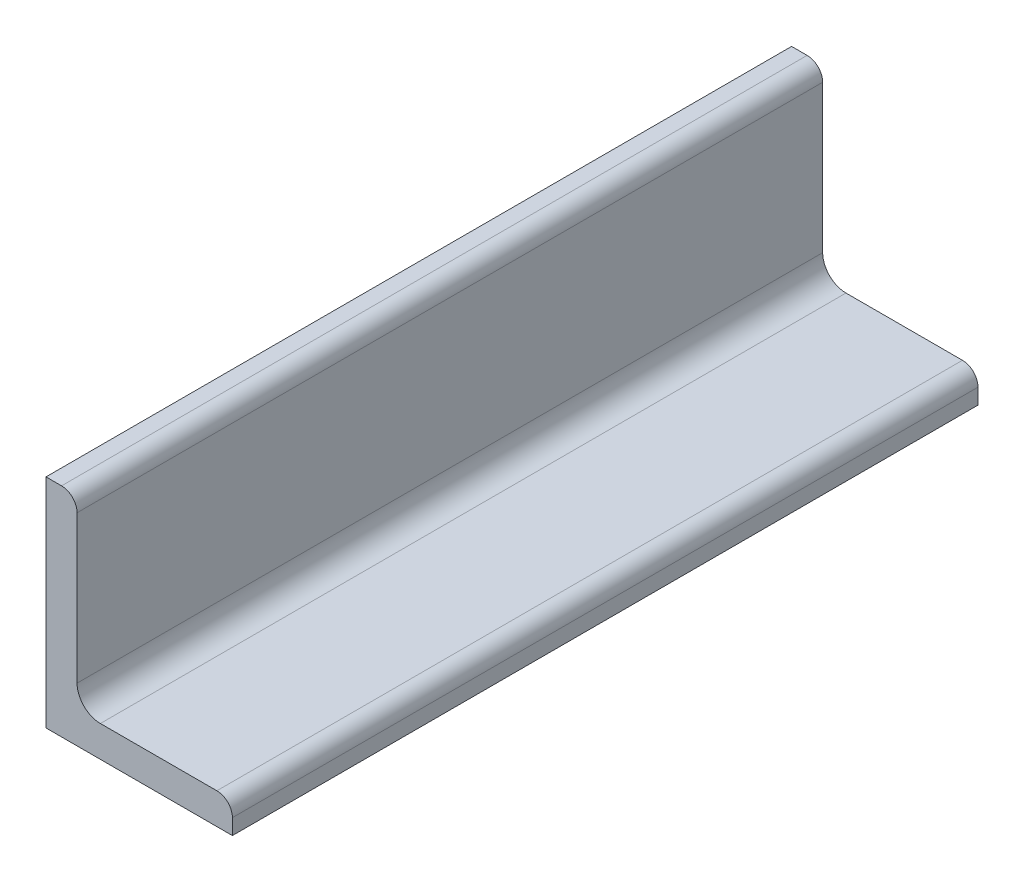
ISO-10303-21;
HEADER;
FILE_DESCRIPTION(('STEP AP214'),'2;1');
FILE_NAME('part.step','',(''),(''),'','','');
FILE_SCHEMA(('AUTOMOTIVE_DESIGN { 1 0 10303 214 1 1 1 1 }'));
ENDSEC;
DATA;
#1=APPLICATION_CONTEXT('core data for automotive mechanical design processes');
#2=APPLICATION_PROTOCOL_DEFINITION('international standard','automotive_design',2000,#1);
#3=PRODUCT_CONTEXT('',#1,'mechanical');
#4=PRODUCT('Part','Part','',(#3));
#5=PRODUCT_RELATED_PRODUCT_CATEGORY('part','',(#4));
#6=PRODUCT_DEFINITION_FORMATION('','',#4);
#7=PRODUCT_DEFINITION_CONTEXT('part definition',#1,'design');
#8=PRODUCT_DEFINITION('design','',#6,#7);
#9=PRODUCT_DEFINITION_SHAPE('','',#8);
#10=(LENGTH_UNIT() NAMED_UNIT(*) SI_UNIT(.MILLI.,.METRE.));
#11=(NAMED_UNIT(*) PLANE_ANGLE_UNIT() SI_UNIT($,.RADIAN.));
#12=(NAMED_UNIT(*) SI_UNIT($,.STERADIAN.) SOLID_ANGLE_UNIT());
#13=UNCERTAINTY_MEASURE_WITH_UNIT(LENGTH_MEASURE(1.E-05),#10,'distance_accuracy_value','');
#14=(GEOMETRIC_REPRESENTATION_CONTEXT(3) GLOBAL_UNCERTAINTY_ASSIGNED_CONTEXT((#13)) GLOBAL_UNIT_ASSIGNED_CONTEXT((#10,
#11,#12)) REPRESENTATION_CONTEXT('',''));
#15=CARTESIAN_POINT('',(0.,0.,0.));
#16=DIRECTION('',(0.,0.,1.));
#17=DIRECTION('',(1.,0.,0.));
#18=AXIS2_PLACEMENT_3D('',#15,#16,#17);
#19=CARTESIAN_POINT('',(0.490776827053332,89.7372005393545,304.8));
#20=DIRECTION('',(1.,0.,0.));
#21=DIRECTION('',(0.,0.,-1.));
#22=AXIS2_PLACEMENT_3D('',#19,#20,#21);
#23=PLANE('',#22);
#24=DIRECTION('',(0.,-1.,0.));
#25=VECTOR('',#24,1.);
#26=CARTESIAN_POINT('',(0.490776827053332,89.7372005393545,0.));
#27=LINE('',#26,#25);
#28=CARTESIAN_POINT('',(0.490776827053332,89.7372005393545,0.));
#29=VERTEX_POINT('',#28);
#30=CARTESIAN_POINT('',(0.490776827053332,0.837200539354535,0.));
#31=VERTEX_POINT('',#30);
#32=EDGE_CURVE('E135',#29,#31,#27,.T.);
#33=ORIENTED_EDGE('',*,*,#32,.T.);
#34=DIRECTION('',(0.,0.,-1.));
#35=VECTOR('',#34,1.);
#36=CARTESIAN_POINT('',(0.490776827053332,0.837200539354535,304.8));
#37=LINE('',#36,#35);
#38=CARTESIAN_POINT('',(0.490776827053332,0.837200539354535,304.8));
#39=VERTEX_POINT('',#38);
#40=EDGE_CURVE('E11',#39,#31,#37,.T.);
#41=ORIENTED_EDGE('',*,*,#40,.F.);
#42=DIRECTION('',(0.,-1.,0.));
#43=VECTOR('',#42,1.);
#44=CARTESIAN_POINT('',(0.490776827053332,89.7372005393545,304.8));
#45=LINE('',#44,#43);
#46=CARTESIAN_POINT('',(0.490776827053332,89.7372005393545,304.8));
#47=VERTEX_POINT('',#46);
#48=EDGE_CURVE('E151',#47,#39,#45,.T.);
#49=ORIENTED_EDGE('',*,*,#48,.F.);
#50=DIRECTION('',(0.,0.,-1.));
#51=VECTOR('',#50,1.);
#52=CARTESIAN_POINT('',(0.490776827053332,89.7372005393545,304.8));
#53=LINE('',#52,#51);
#54=EDGE_CURVE('E131',#47,#29,#53,.T.);
#55=ORIENTED_EDGE('',*,*,#54,.T.);
#56=EDGE_LOOP('',(#33,#41,#49,#55));
#57=FACE_BOUND('',#56,.T.);
#58=ADVANCED_FACE('F33',(#57),#23,.F.);
#59=CARTESIAN_POINT('',(0.490776827053332,0.837200539354535,304.8));
#60=DIRECTION('',(0.,1.,0.));
#61=DIRECTION('',(0.,0.,1.));
#62=AXIS2_PLACEMENT_3D('',#59,#60,#61);
#63=PLANE('',#62);
#64=DIRECTION('',(1.,0.,0.));
#65=VECTOR('',#64,1.);
#66=CARTESIAN_POINT('',(0.490776827053332,0.837200539354535,0.));
#67=LINE('',#66,#65);
#68=CARTESIAN_POINT('',(76.6907768270533,0.837200539354535,0.));
#69=VERTEX_POINT('',#68);
#70=EDGE_CURVE('E138',#31,#69,#67,.T.);
#71=ORIENTED_EDGE('',*,*,#70,.T.);
#72=DIRECTION('',(0.,0.,-1.));
#73=VECTOR('',#72,1.);
#74=CARTESIAN_POINT('',(76.6907768270533,0.837200539354535,304.8));
#75=LINE('',#74,#73);
#76=CARTESIAN_POINT('',(76.6907768270533,0.837200539354535,304.8));
#77=VERTEX_POINT('',#76);
#78=EDGE_CURVE('E41',#77,#69,#75,.T.);
#79=ORIENTED_EDGE('',*,*,#78,.F.);
#80=DIRECTION('',(1.,0.,0.));
#81=VECTOR('',#80,1.);
#82=CARTESIAN_POINT('',(0.490776827053332,0.837200539354535,304.8));
#83=LINE('',#82,#81);
#84=EDGE_CURVE('E95',#39,#77,#83,.T.);
#85=ORIENTED_EDGE('',*,*,#84,.F.);
#86=ORIENTED_EDGE('',*,*,#40,.T.);
#87=EDGE_LOOP('',(#71,#79,#85,#86));
#88=FACE_BOUND('',#87,.T.);
#89=ADVANCED_FACE('F194',(#88),#63,.F.);
#90=CARTESIAN_POINT('',(76.6907768270533,0.837200539354535,304.8));
#91=DIRECTION('',(-1.,0.,0.));
#92=DIRECTION('',(0.,0.,1.));
#93=AXIS2_PLACEMENT_3D('',#90,#91,#92);
#94=PLANE('',#93);
#95=DIRECTION('',(0.,1.,0.));
#96=VECTOR('',#95,1.);
#97=CARTESIAN_POINT('',(76.6907768270533,0.837200539354535,0.));
#98=LINE('',#97,#96);
#99=CARTESIAN_POINT('',(76.6907768270533,7.18720053935453,0.));
#100=VERTEX_POINT('',#99);
#101=EDGE_CURVE('E140',#69,#100,#98,.T.);
#102=ORIENTED_EDGE('',*,*,#101,.T.);
#103=DIRECTION('',(0.,0.,-1.));
#104=VECTOR('',#103,1.);
#105=CARTESIAN_POINT('',(76.6907768270533,7.18720053935453,304.8));
#106=LINE('',#105,#104);
#107=CARTESIAN_POINT('',(76.6907768270533,7.18720053935453,304.8));
#108=VERTEX_POINT('',#107);
#109=EDGE_CURVE('E161',#108,#100,#106,.T.);
#110=ORIENTED_EDGE('',*,*,#109,.F.);
#111=DIRECTION('',(0.,1.,0.));
#112=VECTOR('',#111,1.);
#113=CARTESIAN_POINT('',(76.6907768270533,0.837200539354535,304.8));
#114=LINE('',#113,#112);
#115=EDGE_CURVE('E169',#77,#108,#114,.T.);
#116=ORIENTED_EDGE('',*,*,#115,.F.);
#117=ORIENTED_EDGE('',*,*,#78,.T.);
#118=EDGE_LOOP('',(#102,#110,#116,#117));
#119=FACE_BOUND('',#118,.T.);
#120=ADVANCED_FACE('F167',(#119),#94,.F.);
#121=CARTESIAN_POINT('',(70.3407768270533,7.18720053935453,304.8));
#122=DIRECTION('',(0.,0.,-1.));
#123=DIRECTION('',(-1.,0.,0.));
#124=AXIS2_PLACEMENT_3D('',#121,#122,#123);
#125=CYLINDRICAL_SURFACE('',#124,6.35);
#126=CARTESIAN_POINT('',(70.3407768270533,7.18720053935453,0.));
#127=DIRECTION('',(0.,0.,1.));
#128=DIRECTION('',(1.,0.,0.));
#129=AXIS2_PLACEMENT_3D('',#126,#127,#128);
#130=CIRCLE('',#129,6.35);
#131=CARTESIAN_POINT('',(70.3407768270533,13.5372005393545,0.));
#132=VERTEX_POINT('',#131);
#133=EDGE_CURVE('E142',#100,#132,#130,.T.);
#134=ORIENTED_EDGE('',*,*,#133,.T.);
#135=DIRECTION('',(0.,0.,-1.));
#136=VECTOR('',#135,1.);
#137=CARTESIAN_POINT('',(70.3407768270533,13.5372005393545,304.8));
#138=LINE('',#137,#136);
#139=CARTESIAN_POINT('',(70.3407768270533,13.5372005393545,304.8));
#140=VERTEX_POINT('',#139);
#141=EDGE_CURVE('E158',#140,#132,#138,.T.);
#142=ORIENTED_EDGE('',*,*,#141,.F.);
#143=CARTESIAN_POINT('',(70.3407768270533,7.18720053935453,304.8));
#144=DIRECTION('',(0.,0.,1.));
#145=DIRECTION('',(1.,0.,0.));
#146=AXIS2_PLACEMENT_3D('',#143,#144,#145);
#147=CIRCLE('',#146,6.35);
#148=EDGE_CURVE('E185',#108,#140,#147,.T.);
#149=ORIENTED_EDGE('',*,*,#148,.F.);
#150=ORIENTED_EDGE('',*,*,#109,.T.);
#151=EDGE_LOOP('',(#134,#142,#149,#150));
#152=FACE_BOUND('',#151,.T.);
#153=ADVANCED_FACE('F178',(#152),#125,.T.);
#154=CARTESIAN_POINT('',(70.3407768270533,13.5372005393545,304.8));
#155=DIRECTION('',(0.,-1.,0.));
#156=DIRECTION('',(0.,0.,-1.));
#157=AXIS2_PLACEMENT_3D('',#154,#155,#156);
#158=PLANE('',#157);
#159=DIRECTION('',(-1.,0.,0.));
#160=VECTOR('',#159,1.);
#161=CARTESIAN_POINT('',(70.3407768270533,13.5372005393545,0.));
#162=LINE('',#161,#160);
#163=CARTESIAN_POINT('',(22.7157768270533,13.5372005393545,0.));
#164=VERTEX_POINT('',#163);
#165=EDGE_CURVE('E144',#132,#164,#162,.T.);
#166=ORIENTED_EDGE('',*,*,#165,.T.);
#167=DIRECTION('',(0.,0.,-1.));
#168=VECTOR('',#167,1.);
#169=CARTESIAN_POINT('',(22.7157768270533,13.5372005393545,304.8));
#170=LINE('',#169,#168);
#171=CARTESIAN_POINT('',(22.7157768270533,13.5372005393545,304.8));
#172=VERTEX_POINT('',#171);
#173=EDGE_CURVE('E155',#172,#164,#170,.T.);
#174=ORIENTED_EDGE('',*,*,#173,.F.);
#175=DIRECTION('',(-1.,0.,0.));
#176=VECTOR('',#175,1.);
#177=CARTESIAN_POINT('',(70.3407768270533,13.5372005393545,304.8));
#178=LINE('',#177,#176);
#179=EDGE_CURVE('E184',#140,#172,#178,.T.);
#180=ORIENTED_EDGE('',*,*,#179,.F.);
#181=ORIENTED_EDGE('',*,*,#141,.T.);
#182=EDGE_LOOP('',(#166,#174,#180,#181));
#183=FACE_BOUND('',#182,.T.);
#184=ADVANCED_FACE('F182',(#183),#158,.F.);
#185=CARTESIAN_POINT('',(22.7157768270533,23.0622005393545,304.8));
#186=DIRECTION('',(0.,0.,-1.));
#187=DIRECTION('',(-1.,0.,0.));
#188=AXIS2_PLACEMENT_3D('',#185,#186,#187);
#189=CYLINDRICAL_SURFACE('',#188,9.52499999999999);
#190=CARTESIAN_POINT('',(22.7157768270533,23.0622005393545,0.));
#191=DIRECTION('',(0.,0.,-1.));
#192=DIRECTION('',(1.,0.,0.));
#193=AXIS2_PLACEMENT_3D('',#190,#191,#192);
#194=CIRCLE('',#193,9.52499999999999);
#195=CARTESIAN_POINT('',(13.1907768270533,23.0622005393545,0.));
#196=VERTEX_POINT('',#195);
#197=EDGE_CURVE('E146',#164,#196,#194,.T.);
#198=ORIENTED_EDGE('',*,*,#197,.T.);
#199=DIRECTION('',(0.,0.,-1.));
#200=VECTOR('',#199,1.);
#201=CARTESIAN_POINT('',(13.1907768270533,23.0622005393545,304.8));
#202=LINE('',#201,#200);
#203=CARTESIAN_POINT('',(13.1907768270533,23.0622005393545,304.8));
#204=VERTEX_POINT('',#203);
#205=EDGE_CURVE('E126',#204,#196,#202,.T.);
#206=ORIENTED_EDGE('',*,*,#205,.F.);
#207=CARTESIAN_POINT('',(22.7157768270533,23.0622005393545,304.8));
#208=DIRECTION('',(0.,0.,-1.));
#209=DIRECTION('',(1.,0.,0.));
#210=AXIS2_PLACEMENT_3D('',#207,#208,#209);
#211=CIRCLE('',#210,9.52499999999999);
#212=EDGE_CURVE('E117',#172,#204,#211,.T.);
#213=ORIENTED_EDGE('',*,*,#212,.F.);
#214=ORIENTED_EDGE('',*,*,#173,.T.);
#215=EDGE_LOOP('',(#198,#206,#213,#214));
#216=FACE_BOUND('',#215,.T.);
#217=ADVANCED_FACE('F206',(#216),#189,.F.);
#218=CARTESIAN_POINT('',(13.1907768270533,23.0622005393545,304.8));
#219=DIRECTION('',(-1.,0.,0.));
#220=DIRECTION('',(0.,0.,1.));
#221=AXIS2_PLACEMENT_3D('',#218,#219,#220);
#222=PLANE('',#221);
#223=DIRECTION('',(0.,1.,0.));
#224=VECTOR('',#223,1.);
#225=CARTESIAN_POINT('',(13.1907768270533,23.0622005393545,0.));
#226=LINE('',#225,#224);
#227=CARTESIAN_POINT('',(13.1907768270533,83.3872005393545,0.));
#228=VERTEX_POINT('',#227);
#229=EDGE_CURVE('E125',#196,#228,#226,.T.);
#230=ORIENTED_EDGE('',*,*,#229,.T.);
#231=DIRECTION('',(0.,0.,-1.));
#232=VECTOR('',#231,1.);
#233=CARTESIAN_POINT('',(13.1907768270533,83.3872005393545,304.8));
#234=LINE('',#233,#232);
#235=CARTESIAN_POINT('',(13.1907768270533,83.3872005393545,304.8));
#236=VERTEX_POINT('',#235);
#237=EDGE_CURVE('E122',#236,#228,#234,.T.);
#238=ORIENTED_EDGE('',*,*,#237,.F.);
#239=DIRECTION('',(0.,1.,0.));
#240=VECTOR('',#239,1.);
#241=CARTESIAN_POINT('',(13.1907768270533,23.0622005393545,304.8));
#242=LINE('',#241,#240);
#243=EDGE_CURVE('E111',#204,#236,#242,.T.);
#244=ORIENTED_EDGE('',*,*,#243,.F.);
#245=ORIENTED_EDGE('',*,*,#205,.T.);
#246=EDGE_LOOP('',(#230,#238,#244,#245));
#247=FACE_BOUND('',#246,.T.);
#248=ADVANCED_FACE('F123',(#247),#222,.F.);
#249=CARTESIAN_POINT('',(6.84077682705333,83.3872005393545,304.8));
#250=DIRECTION('',(0.,0.,-1.));
#251=DIRECTION('',(-1.,0.,0.));
#252=AXIS2_PLACEMENT_3D('',#249,#250,#251);
#253=CYLINDRICAL_SURFACE('',#252,6.35);
#254=CARTESIAN_POINT('',(6.84077682705333,83.3872005393545,0.));
#255=DIRECTION('',(0.,0.,1.));
#256=DIRECTION('',(1.,0.,0.));
#257=AXIS2_PLACEMENT_3D('',#254,#255,#256);
#258=CIRCLE('',#257,6.35);
#259=CARTESIAN_POINT('',(6.84077682705333,89.7372005393545,0.));
#260=VERTEX_POINT('',#259);
#261=EDGE_CURVE('E81',#228,#260,#258,.T.);
#262=ORIENTED_EDGE('',*,*,#261,.T.);
#263=DIRECTION('',(0.,0.,-1.));
#264=VECTOR('',#263,1.);
#265=CARTESIAN_POINT('',(6.84077682705333,89.7372005393545,304.8));
#266=LINE('',#265,#264);
#267=CARTESIAN_POINT('',(6.84077682705333,89.7372005393545,304.8));
#268=VERTEX_POINT('',#267);
#269=EDGE_CURVE('E127',#268,#260,#266,.T.);
#270=ORIENTED_EDGE('',*,*,#269,.F.);
#271=CARTESIAN_POINT('',(6.84077682705333,83.3872005393545,304.8));
#272=DIRECTION('',(0.,0.,1.));
#273=DIRECTION('',(1.,0.,0.));
#274=AXIS2_PLACEMENT_3D('',#271,#272,#273);
#275=CIRCLE('',#274,6.35);
#276=EDGE_CURVE('E115',#236,#268,#275,.T.);
#277=ORIENTED_EDGE('',*,*,#276,.F.);
#278=ORIENTED_EDGE('',*,*,#237,.T.);
#279=EDGE_LOOP('',(#262,#270,#277,#278));
#280=FACE_BOUND('',#279,.T.);
#281=ADVANCED_FACE('F129',(#280),#253,.T.);
#282=CARTESIAN_POINT('',(6.84077682705333,89.7372005393545,304.8));
#283=DIRECTION('',(0.,-1.,0.));
#284=DIRECTION('',(0.,0.,-1.));
#285=AXIS2_PLACEMENT_3D('',#282,#283,#284);
#286=PLANE('',#285);
#287=DIRECTION('',(-1.,0.,0.));
#288=VECTOR('',#287,1.);
#289=CARTESIAN_POINT('',(6.84077682705333,89.7372005393545,0.));
#290=LINE('',#289,#288);
#291=EDGE_CURVE('E87',#260,#29,#290,.T.);
#292=ORIENTED_EDGE('',*,*,#291,.T.);
#293=ORIENTED_EDGE('',*,*,#54,.F.);
#294=DIRECTION('',(-1.,0.,0.));
#295=VECTOR('',#294,1.);
#296=CARTESIAN_POINT('',(6.84077682705333,89.7372005393545,304.8));
#297=LINE('',#296,#295);
#298=EDGE_CURVE('E49',#268,#47,#297,.T.);
#299=ORIENTED_EDGE('',*,*,#298,.F.);
#300=ORIENTED_EDGE('',*,*,#269,.T.);
#301=EDGE_LOOP('',(#292,#293,#299,#300));
#302=FACE_BOUND('',#301,.T.);
#303=ADVANCED_FACE('F214',(#302),#286,.F.);
#304=CARTESIAN_POINT('',(70.3407768270533,7.18720053935453,304.8));
#305=DIRECTION('',(0.,0.,1.));
#306=DIRECTION('',(1.,0.,0.));
#307=AXIS2_PLACEMENT_3D('',#304,#305,#306);
#308=PLANE('',#307);
#309=ORIENTED_EDGE('',*,*,#48,.T.);
#310=ORIENTED_EDGE('',*,*,#84,.T.);
#311=ORIENTED_EDGE('',*,*,#115,.T.);
#312=ORIENTED_EDGE('',*,*,#148,.T.);
#313=ORIENTED_EDGE('',*,*,#179,.T.);
#314=ORIENTED_EDGE('',*,*,#212,.T.);
#315=ORIENTED_EDGE('',*,*,#243,.T.);
#316=ORIENTED_EDGE('',*,*,#276,.T.);
#317=ORIENTED_EDGE('',*,*,#298,.T.);
#318=EDGE_LOOP('',(#309,#310,#311,#312,#313,#314,#315,#316,#317));
#319=FACE_BOUND('',#318,.T.);
#320=ADVANCED_FACE('F113',(#319),#308,.T.);
#321=CARTESIAN_POINT('',(70.3407768270533,7.18720053935453,0.));
#322=DIRECTION('',(0.,0.,1.));
#323=DIRECTION('',(1.,0.,0.));
#324=AXIS2_PLACEMENT_3D('',#321,#322,#323);
#325=PLANE('',#324);
#326=ORIENTED_EDGE('',*,*,#32,.F.);
#327=ORIENTED_EDGE('',*,*,#291,.F.);
#328=ORIENTED_EDGE('',*,*,#261,.F.);
#329=ORIENTED_EDGE('',*,*,#229,.F.);
#330=ORIENTED_EDGE('',*,*,#197,.F.);
#331=ORIENTED_EDGE('',*,*,#165,.F.);
#332=ORIENTED_EDGE('',*,*,#133,.F.);
#333=ORIENTED_EDGE('',*,*,#101,.F.);
#334=ORIENTED_EDGE('',*,*,#70,.F.);
#335=EDGE_LOOP('',(#326,#327,#328,#329,#330,#331,#332,#333,#334));
#336=FACE_BOUND('',#335,.T.);
#337=ADVANCED_FACE('F173',(#336),#325,.F.);
#338=CLOSED_SHELL('',(#58,#89,#120,#153,#184,#217,#248,#281,#303,#320,#337));
#339=MANIFOLD_SOLID_BREP('B2',#338);
#340=ADVANCED_BREP_SHAPE_REPRESENTATION('',(#18,#339),#14);
#341=SHAPE_DEFINITION_REPRESENTATION(#9,#340);
ENDSEC;
END-ISO-10303-21;
